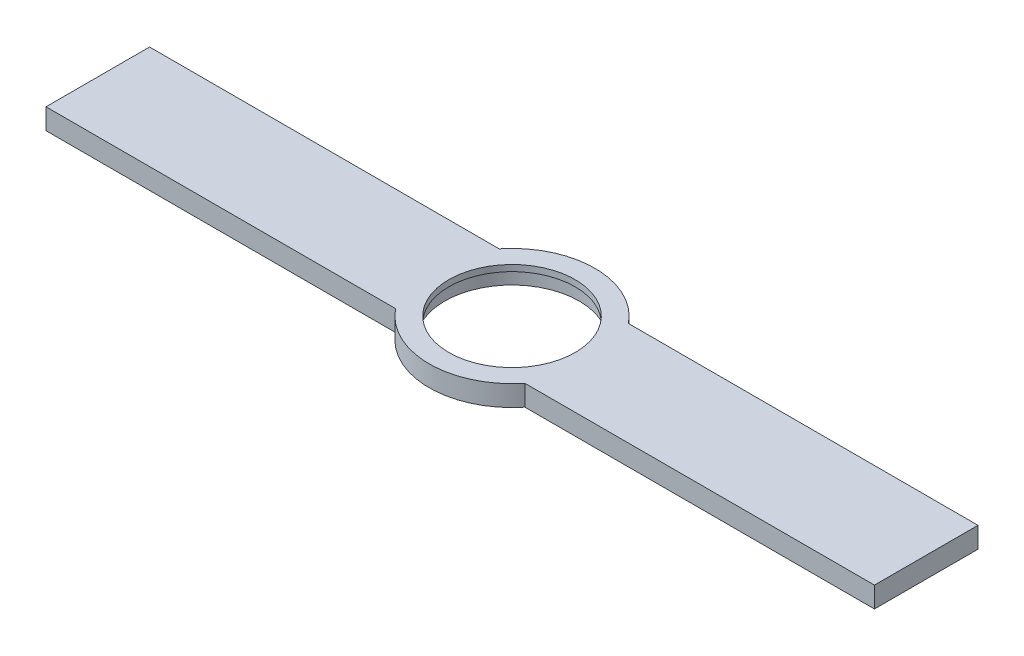
ISO-10303-21;
HEADER;
FILE_DESCRIPTION(('STEP AP214'),'2;1');
FILE_NAME('part.step','',(''),(''),'','','');
FILE_SCHEMA(('AUTOMOTIVE_DESIGN { 1 0 10303 214 1 1 1 1 }'));
ENDSEC;
DATA;
#1=APPLICATION_CONTEXT('core data for automotive mechanical design processes');
#2=APPLICATION_PROTOCOL_DEFINITION('international standard','automotive_design',2000,#1);
#3=PRODUCT_CONTEXT('',#1,'mechanical');
#4=PRODUCT('Part','Part','',(#3));
#5=PRODUCT_RELATED_PRODUCT_CATEGORY('part','',(#4));
#6=PRODUCT_DEFINITION_FORMATION('','',#4);
#7=PRODUCT_DEFINITION_CONTEXT('part definition',#1,'design');
#8=PRODUCT_DEFINITION('design','',#6,#7);
#9=PRODUCT_DEFINITION_SHAPE('','',#8);
#10=(LENGTH_UNIT() NAMED_UNIT(*) SI_UNIT(.MILLI.,.METRE.));
#11=(NAMED_UNIT(*) PLANE_ANGLE_UNIT() SI_UNIT($,.RADIAN.));
#12=(NAMED_UNIT(*) SI_UNIT($,.STERADIAN.) SOLID_ANGLE_UNIT());
#13=UNCERTAINTY_MEASURE_WITH_UNIT(LENGTH_MEASURE(1.E-05),#10,'distance_accuracy_value','');
#14=(GEOMETRIC_REPRESENTATION_CONTEXT(3) GLOBAL_UNCERTAINTY_ASSIGNED_CONTEXT((#13)) GLOBAL_UNIT_ASSIGNED_CONTEXT((#10,
#11,#12)) REPRESENTATION_CONTEXT('',''));
#15=CARTESIAN_POINT('',(0.,0.,0.));
#16=DIRECTION('',(0.,0.,1.));
#17=DIRECTION('',(1.,0.,0.));
#18=AXIS2_PLACEMENT_3D('',#15,#16,#17);
#19=CARTESIAN_POINT('',(0.,-0.000999999999999265,0.));
#20=DIRECTION('',(0.,1.,0.));
#21=DIRECTION('',(0.,0.,1.));
#22=AXIS2_PLACEMENT_3D('',#19,#20,#21);
#23=CYLINDRICAL_SURFACE('',#22,30.5);
#24=CARTESIAN_POINT('',(0.,10.,0.));
#25=DIRECTION('',(0.,1.,0.));
#26=DIRECTION('',(0.,0.,1.));
#27=AXIS2_PLACEMENT_3D('',#24,#25,#26);
#28=CIRCLE('',#27,30.5);
#29=CARTESIAN_POINT('',(0.,10.,30.5));
#30=VERTEX_POINT('',#29);
#31=EDGE_CURVE('E141',#30,#30,#28,.T.);
#32=ORIENTED_EDGE('',*,*,#31,.T.);
#33=EDGE_LOOP('',(#32));
#34=FACE_BOUND('',#33,.T.);
#35=CARTESIAN_POINT('',(0.,7.,0.));
#36=DIRECTION('',(0.,-1.,0.));
#37=DIRECTION('',(0.,0.,-1.));
#38=AXIS2_PLACEMENT_3D('',#35,#36,#37);
#39=CIRCLE('',#38,30.5);
#40=CARTESIAN_POINT('',(0.,7.,-30.5));
#41=VERTEX_POINT('',#40);
#42=EDGE_CURVE('E45',#41,#41,#39,.F.);
#43=ORIENTED_EDGE('',*,*,#42,.F.);
#44=EDGE_LOOP('',(#43));
#45=FACE_BOUND('',#44,.T.);
#46=ADVANCED_FACE('F41',(#34,#45),#23,.F.);
#47=CARTESIAN_POINT('',(0.,10.,0.));
#48=DIRECTION('',(0.,-1.,0.));
#49=DIRECTION('',(0.,0.,-1.));
#50=AXIS2_PLACEMENT_3D('',#47,#48,#49);
#51=CYLINDRICAL_SURFACE('',#50,40.);
#52=CARTESIAN_POINT('',(0.,0.,0.));
#53=DIRECTION('',(0.,1.,0.));
#54=DIRECTION('',(0.,0.,1.));
#55=AXIS2_PLACEMENT_3D('',#52,#53,#54);
#56=CIRCLE('',#55,40.);
#57=CARTESIAN_POINT('',(31.2249899919919,0.,-25.));
#58=VERTEX_POINT('',#57);
#59=CARTESIAN_POINT('',(-31.2249899919921,0.,-25.));
#60=VERTEX_POINT('',#59);
#61=EDGE_CURVE('E138',#58,#60,#56,.T.);
#62=ORIENTED_EDGE('',*,*,#61,.T.);
#63=DIRECTION('',(0.,-1.,0.));
#64=VECTOR('',#63,1.);
#65=CARTESIAN_POINT('',(-31.2249899919921,10.,-25.));
#66=LINE('',#65,#64);
#67=CARTESIAN_POINT('',(-31.2249899919921,10.,-25.));
#68=VERTEX_POINT('',#67);
#69=EDGE_CURVE('E11',#68,#60,#66,.T.);
#70=ORIENTED_EDGE('',*,*,#69,.F.);
#71=CARTESIAN_POINT('',(0.,10.,0.));
#72=DIRECTION('',(0.,1.,0.));
#73=DIRECTION('',(0.,0.,1.));
#74=AXIS2_PLACEMENT_3D('',#71,#72,#73);
#75=CIRCLE('',#74,40.);
#76=CARTESIAN_POINT('',(31.2249899919919,10.,-25.));
#77=VERTEX_POINT('',#76);
#78=EDGE_CURVE('E96',#77,#68,#75,.T.);
#79=ORIENTED_EDGE('',*,*,#78,.F.);
#80=DIRECTION('',(0.,-1.,0.));
#81=VECTOR('',#80,1.);
#82=CARTESIAN_POINT('',(31.2249899919919,10.,-25.));
#83=LINE('',#82,#81);
#84=EDGE_CURVE('E59',#77,#58,#83,.T.);
#85=ORIENTED_EDGE('',*,*,#84,.T.);
#86=EDGE_LOOP('',(#62,#70,#79,#85));
#87=FACE_BOUND('',#86,.T.);
#88=ADVANCED_FACE('F43',(#87),#51,.T.);
#89=CARTESIAN_POINT('',(0.,10.,-25.));
#90=DIRECTION('',(0.,0.,-1.));
#91=DIRECTION('',(-1.,0.,0.));
#92=AXIS2_PLACEMENT_3D('',#89,#90,#91);
#93=PLANE('',#92);
#94=DIRECTION('',(1.,0.,0.));
#95=VECTOR('',#94,1.);
#96=CARTESIAN_POINT('',(0.,0.,-25.));
#97=LINE('',#96,#95);
#98=CARTESIAN_POINT('',(-200.,0.,-25.));
#99=VERTEX_POINT('',#98);
#100=EDGE_CURVE('E140',#99,#60,#97,.T.);
#101=ORIENTED_EDGE('',*,*,#100,.F.);
#102=DIRECTION('',(0.,-1.,0.));
#103=VECTOR('',#102,1.);
#104=CARTESIAN_POINT('',(-200.,10.,-25.));
#105=LINE('',#104,#103);
#106=CARTESIAN_POINT('',(-200.,10.,-25.));
#107=VERTEX_POINT('',#106);
#108=EDGE_CURVE('E51',#107,#99,#105,.T.);
#109=ORIENTED_EDGE('',*,*,#108,.F.);
#110=DIRECTION('',(1.,0.,0.));
#111=VECTOR('',#110,1.);
#112=CARTESIAN_POINT('',(0.,10.,-25.));
#113=LINE('',#112,#111);
#114=EDGE_CURVE('E179',#107,#68,#113,.T.);
#115=ORIENTED_EDGE('',*,*,#114,.T.);
#116=ORIENTED_EDGE('',*,*,#69,.T.);
#117=EDGE_LOOP('',(#101,#109,#115,#116));
#118=FACE_BOUND('',#117,.T.);
#119=ADVANCED_FACE('F178',(#118),#93,.T.);
#120=CARTESIAN_POINT('',(-200.,10.,0.));
#121=DIRECTION('',(1.,0.,0.));
#122=DIRECTION('',(0.,0.,-1.));
#123=AXIS2_PLACEMENT_3D('',#120,#121,#122);
#124=PLANE('',#123);
#125=DIRECTION('',(0.,0.,1.));
#126=VECTOR('',#125,1.);
#127=CARTESIAN_POINT('',(-200.,0.,0.));
#128=LINE('',#127,#126);
#129=CARTESIAN_POINT('',(-200.,0.,25.));
#130=VERTEX_POINT('',#129);
#131=EDGE_CURVE('E144',#99,#130,#128,.T.);
#132=ORIENTED_EDGE('',*,*,#131,.T.);
#133=DIRECTION('',(0.,-1.,0.));
#134=VECTOR('',#133,1.);
#135=CARTESIAN_POINT('',(-200.,10.,25.));
#136=LINE('',#135,#134);
#137=CARTESIAN_POINT('',(-200.,10.,25.));
#138=VERTEX_POINT('',#137);
#139=EDGE_CURVE('E162',#138,#130,#136,.T.);
#140=ORIENTED_EDGE('',*,*,#139,.F.);
#141=DIRECTION('',(0.,0.,1.));
#142=VECTOR('',#141,1.);
#143=CARTESIAN_POINT('',(-200.,10.,0.));
#144=LINE('',#143,#142);
#145=EDGE_CURVE('E170',#107,#138,#144,.T.);
#146=ORIENTED_EDGE('',*,*,#145,.F.);
#147=ORIENTED_EDGE('',*,*,#108,.T.);
#148=EDGE_LOOP('',(#132,#140,#146,#147));
#149=FACE_BOUND('',#148,.T.);
#150=ADVANCED_FACE('F168',(#149),#124,.F.);
#151=CARTESIAN_POINT('',(0.,10.,25.));
#152=DIRECTION('',(0.,0.,-1.));
#153=DIRECTION('',(-1.,0.,0.));
#154=AXIS2_PLACEMENT_3D('',#151,#152,#153);
#155=PLANE('',#154);
#156=DIRECTION('',(1.,0.,0.));
#157=VECTOR('',#156,1.);
#158=CARTESIAN_POINT('',(0.,0.,25.));
#159=LINE('',#158,#157);
#160=CARTESIAN_POINT('',(-31.2249899919921,0.,25.));
#161=VERTEX_POINT('',#160);
#162=EDGE_CURVE('E146',#130,#161,#159,.T.);
#163=ORIENTED_EDGE('',*,*,#162,.T.);
#164=DIRECTION('',(0.,-1.,0.));
#165=VECTOR('',#164,1.);
#166=CARTESIAN_POINT('',(-31.2249899919921,10.,25.));
#167=LINE('',#166,#165);
#168=CARTESIAN_POINT('',(-31.2249899919921,10.,25.));
#169=VERTEX_POINT('',#168);
#170=EDGE_CURVE('E159',#169,#161,#167,.T.);
#171=ORIENTED_EDGE('',*,*,#170,.F.);
#172=DIRECTION('',(1.,0.,0.));
#173=VECTOR('',#172,1.);
#174=CARTESIAN_POINT('',(0.,10.,25.));
#175=LINE('',#174,#173);
#176=EDGE_CURVE('E222',#138,#169,#175,.T.);
#177=ORIENTED_EDGE('',*,*,#176,.F.);
#178=ORIENTED_EDGE('',*,*,#139,.T.);
#179=EDGE_LOOP('',(#163,#171,#177,#178));
#180=FACE_BOUND('',#179,.T.);
#181=ADVANCED_FACE('F226',(#180),#155,.F.);
#182=CARTESIAN_POINT('',(0.,10.,0.));
#183=DIRECTION('',(0.,-1.,0.));
#184=DIRECTION('',(0.,0.,-1.));
#185=AXIS2_PLACEMENT_3D('',#182,#183,#184);
#186=CYLINDRICAL_SURFACE('',#185,40.);
#187=CARTESIAN_POINT('',(0.,0.,0.));
#188=DIRECTION('',(0.,1.,0.));
#189=DIRECTION('',(0.,0.,1.));
#190=AXIS2_PLACEMENT_3D('',#187,#188,#189);
#191=CIRCLE('',#190,40.);
#192=CARTESIAN_POINT('',(31.2249899919919,0.,25.));
#193=VERTEX_POINT('',#192);
#194=EDGE_CURVE('E148',#161,#193,#191,.T.);
#195=ORIENTED_EDGE('',*,*,#194,.T.);
#196=DIRECTION('',(0.,-1.,0.));
#197=VECTOR('',#196,1.);
#198=CARTESIAN_POINT('',(31.2249899919919,10.,25.));
#199=LINE('',#198,#197);
#200=CARTESIAN_POINT('',(31.2249899919919,10.,25.));
#201=VERTEX_POINT('',#200);
#202=EDGE_CURVE('E130',#201,#193,#199,.T.);
#203=ORIENTED_EDGE('',*,*,#202,.F.);
#204=CARTESIAN_POINT('',(0.,10.,0.));
#205=DIRECTION('',(0.,1.,0.));
#206=DIRECTION('',(0.,0.,1.));
#207=AXIS2_PLACEMENT_3D('',#204,#205,#206);
#208=CIRCLE('',#207,40.);
#209=EDGE_CURVE('E118',#169,#201,#208,.T.);
#210=ORIENTED_EDGE('',*,*,#209,.F.);
#211=ORIENTED_EDGE('',*,*,#170,.T.);
#212=EDGE_LOOP('',(#195,#203,#210,#211));
#213=FACE_BOUND('',#212,.T.);
#214=ADVANCED_FACE('F228',(#213),#186,.T.);
#215=CARTESIAN_POINT('',(0.,10.,25.));
#216=DIRECTION('',(0.,0.,-1.));
#217=DIRECTION('',(-1.,0.,0.));
#218=AXIS2_PLACEMENT_3D('',#215,#216,#217);
#219=PLANE('',#218);
#220=DIRECTION('',(1.,0.,0.));
#221=VECTOR('',#220,1.);
#222=CARTESIAN_POINT('',(0.,0.,25.));
#223=LINE('',#222,#221);
#224=CARTESIAN_POINT('',(200.,0.,25.));
#225=VERTEX_POINT('',#224);
#226=EDGE_CURVE('E127',#193,#225,#223,.T.);
#227=ORIENTED_EDGE('',*,*,#226,.T.);
#228=DIRECTION('',(0.,-1.,0.));
#229=VECTOR('',#228,1.);
#230=CARTESIAN_POINT('',(200.,10.,25.));
#231=LINE('',#230,#229);
#232=CARTESIAN_POINT('',(200.,10.,25.));
#233=VERTEX_POINT('',#232);
#234=EDGE_CURVE('E124',#233,#225,#231,.T.);
#235=ORIENTED_EDGE('',*,*,#234,.F.);
#236=DIRECTION('',(1.,0.,0.));
#237=VECTOR('',#236,1.);
#238=CARTESIAN_POINT('',(0.,10.,25.));
#239=LINE('',#238,#237);
#240=EDGE_CURVE('E112',#201,#233,#239,.T.);
#241=ORIENTED_EDGE('',*,*,#240,.F.);
#242=ORIENTED_EDGE('',*,*,#202,.T.);
#243=EDGE_LOOP('',(#227,#235,#241,#242));
#244=FACE_BOUND('',#243,.T.);
#245=ADVANCED_FACE('F125',(#244),#219,.F.);
#246=CARTESIAN_POINT('',(200.,10.,0.));
#247=DIRECTION('',(1.,0.,0.));
#248=DIRECTION('',(0.,0.,-1.));
#249=AXIS2_PLACEMENT_3D('',#246,#247,#248);
#250=PLANE('',#249);
#251=DIRECTION('',(0.,0.,1.));
#252=VECTOR('',#251,1.);
#253=CARTESIAN_POINT('',(200.,0.,0.));
#254=LINE('',#253,#252);
#255=CARTESIAN_POINT('',(200.,0.,-25.));
#256=VERTEX_POINT('',#255);
#257=EDGE_CURVE('E151',#256,#225,#254,.T.);
#258=ORIENTED_EDGE('',*,*,#257,.F.);
#259=DIRECTION('',(0.,-1.,0.));
#260=VECTOR('',#259,1.);
#261=CARTESIAN_POINT('',(200.,10.,-25.));
#262=LINE('',#261,#260);
#263=CARTESIAN_POINT('',(200.,10.,-25.));
#264=VERTEX_POINT('',#263);
#265=EDGE_CURVE('E84',#264,#256,#262,.T.);
#266=ORIENTED_EDGE('',*,*,#265,.F.);
#267=DIRECTION('',(0.,0.,1.));
#268=VECTOR('',#267,1.);
#269=CARTESIAN_POINT('',(200.,10.,0.));
#270=LINE('',#269,#268);
#271=EDGE_CURVE('E116',#264,#233,#270,.T.);
#272=ORIENTED_EDGE('',*,*,#271,.T.);
#273=ORIENTED_EDGE('',*,*,#234,.T.);
#274=EDGE_LOOP('',(#258,#266,#272,#273));
#275=FACE_BOUND('',#274,.T.);
#276=ADVANCED_FACE('F132',(#275),#250,.T.);
#277=CARTESIAN_POINT('',(0.,10.,-25.));
#278=DIRECTION('',(0.,0.,-1.));
#279=DIRECTION('',(-1.,0.,0.));
#280=AXIS2_PLACEMENT_3D('',#277,#278,#279);
#281=PLANE('',#280);
#282=DIRECTION('',(1.,0.,0.));
#283=VECTOR('',#282,1.);
#284=CARTESIAN_POINT('',(0.,0.,-25.));
#285=LINE('',#284,#283);
#286=EDGE_CURVE('E153',#58,#256,#285,.T.);
#287=ORIENTED_EDGE('',*,*,#286,.F.);
#288=ORIENTED_EDGE('',*,*,#84,.F.);
#289=DIRECTION('',(1.,0.,0.));
#290=VECTOR('',#289,1.);
#291=CARTESIAN_POINT('',(0.,10.,-25.));
#292=LINE('',#291,#290);
#293=EDGE_CURVE('E133',#77,#264,#292,.T.);
#294=ORIENTED_EDGE('',*,*,#293,.T.);
#295=ORIENTED_EDGE('',*,*,#265,.T.);
#296=EDGE_LOOP('',(#287,#288,#294,#295));
#297=FACE_BOUND('',#296,.T.);
#298=ADVANCED_FACE('F180',(#297),#281,.T.);
#299=CARTESIAN_POINT('',(0.,10.,0.));
#300=DIRECTION('',(0.,1.,0.));
#301=DIRECTION('',(0.,0.,1.));
#302=AXIS2_PLACEMENT_3D('',#299,#300,#301);
#303=PLANE('',#302);
#304=ORIENTED_EDGE('',*,*,#31,.F.);
#305=EDGE_LOOP('',(#304));
#306=FACE_BOUND('',#305,.T.);
#307=ORIENTED_EDGE('',*,*,#78,.T.);
#308=ORIENTED_EDGE('',*,*,#114,.F.);
#309=ORIENTED_EDGE('',*,*,#145,.T.);
#310=ORIENTED_EDGE('',*,*,#176,.T.);
#311=ORIENTED_EDGE('',*,*,#209,.T.);
#312=ORIENTED_EDGE('',*,*,#240,.T.);
#313=ORIENTED_EDGE('',*,*,#271,.F.);
#314=ORIENTED_EDGE('',*,*,#293,.F.);
#315=EDGE_LOOP('',(#307,#308,#309,#310,#311,#312,#313,#314));
#316=FACE_BOUND('',#315,.T.);
#317=ADVANCED_FACE('F114',(#306,#316),#303,.T.);
#318=CARTESIAN_POINT('',(0.,0.,0.));
#319=DIRECTION('',(0.,1.,0.));
#320=DIRECTION('',(0.,0.,1.));
#321=AXIS2_PLACEMENT_3D('',#318,#319,#320);
#322=PLANE('',#321);
#323=CARTESIAN_POINT('',(0.,0.,0.));
#324=DIRECTION('',(0.,-1.,0.));
#325=DIRECTION('',(0.,0.,-1.));
#326=AXIS2_PLACEMENT_3D('',#323,#324,#325);
#327=CIRCLE('',#326,32.5);
#328=CARTESIAN_POINT('',(0.,0.,-32.5));
#329=VERTEX_POINT('',#328);
#330=EDGE_CURVE('E211',#329,#329,#327,.T.);
#331=ORIENTED_EDGE('',*,*,#330,.F.);
#332=EDGE_LOOP('',(#331));
#333=FACE_BOUND('',#332,.T.);
#334=ORIENTED_EDGE('',*,*,#61,.F.);
#335=ORIENTED_EDGE('',*,*,#286,.T.);
#336=ORIENTED_EDGE('',*,*,#257,.T.);
#337=ORIENTED_EDGE('',*,*,#226,.F.);
#338=ORIENTED_EDGE('',*,*,#194,.F.);
#339=ORIENTED_EDGE('',*,*,#162,.F.);
#340=ORIENTED_EDGE('',*,*,#131,.F.);
#341=ORIENTED_EDGE('',*,*,#100,.T.);
#342=EDGE_LOOP('',(#334,#335,#336,#337,#338,#339,#340,#341));
#343=FACE_BOUND('',#342,.T.);
#344=ADVANCED_FACE('F176',(#333,#343),#322,.F.);
#345=CARTESIAN_POINT('',(0.,7.,0.));
#346=DIRECTION('',(0.,-1.,0.));
#347=DIRECTION('',(0.,0.,-1.));
#348=AXIS2_PLACEMENT_3D('',#345,#346,#347);
#349=PLANE('',#348);
#350=CARTESIAN_POINT('',(0.,7.,0.));
#351=DIRECTION('',(0.,-1.,0.));
#352=DIRECTION('',(0.,0.,-1.));
#353=AXIS2_PLACEMENT_3D('',#350,#351,#352);
#354=CIRCLE('',#353,32.5);
#355=CARTESIAN_POINT('',(0.,7.,-32.5));
#356=VERTEX_POINT('',#355);
#357=EDGE_CURVE('E213',#356,#356,#354,.T.);
#358=ORIENTED_EDGE('',*,*,#357,.T.);
#359=EDGE_LOOP('',(#358));
#360=FACE_BOUND('',#359,.T.);
#361=ORIENTED_EDGE('',*,*,#42,.T.);
#362=EDGE_LOOP('',(#361));
#363=FACE_BOUND('',#362,.T.);
#364=ADVANCED_FACE('F203',(#360,#363),#349,.T.);
#365=CARTESIAN_POINT('',(0.,7.,0.));
#366=DIRECTION('',(0.,-1.,0.));
#367=DIRECTION('',(0.,0.,-1.));
#368=AXIS2_PLACEMENT_3D('',#365,#366,#367);
#369=CYLINDRICAL_SURFACE('',#368,32.5);
#370=ORIENTED_EDGE('',*,*,#357,.F.);
#371=EDGE_LOOP('',(#370));
#372=FACE_BOUND('',#371,.T.);
#373=ORIENTED_EDGE('',*,*,#330,.T.);
#374=EDGE_LOOP('',(#373));
#375=FACE_BOUND('',#374,.T.);
#376=ADVANCED_FACE('F201',(#372,#375),#369,.F.);
#377=CLOSED_SHELL('',(#46,#88,#119,#150,#181,#214,#245,#276,#298,#317,#344,#364,#376));
#378=MANIFOLD_SOLID_BREP('B2',#377);
#379=ADVANCED_BREP_SHAPE_REPRESENTATION('',(#18,#378),#14);
#380=SHAPE_DEFINITION_REPRESENTATION(#9,#379);
ENDSEC;
END-ISO-10303-21;
